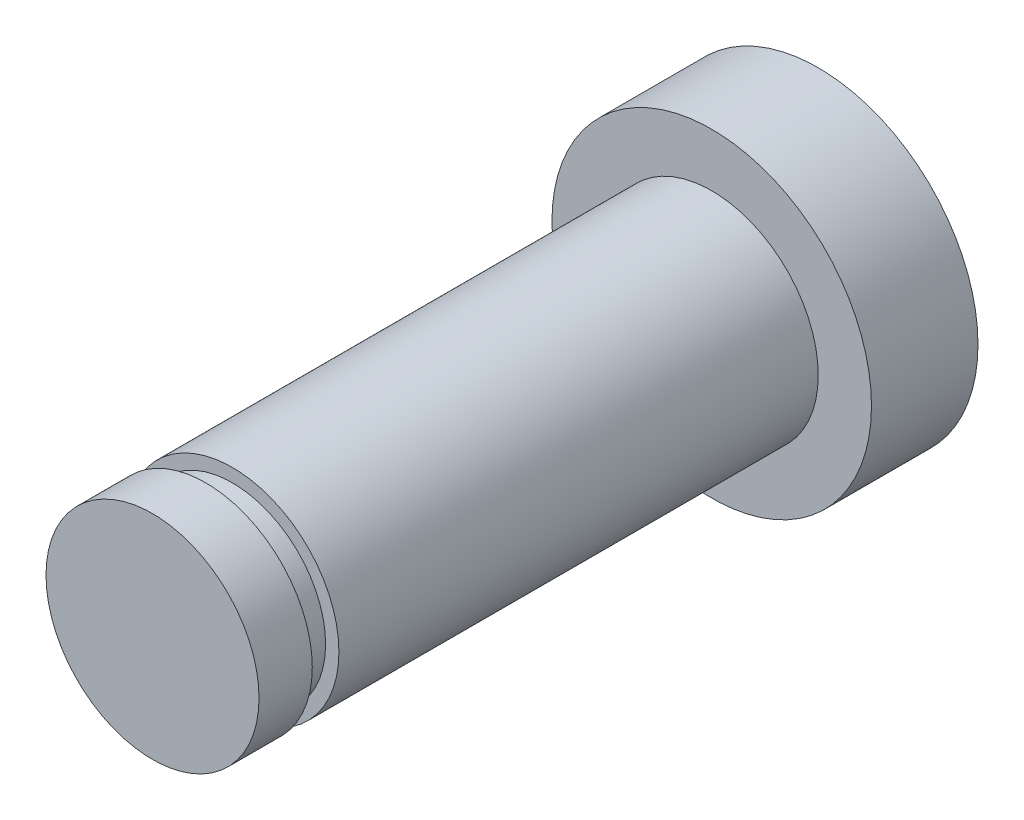
ISO-10303-21;
HEADER;
FILE_DESCRIPTION(('STEP AP214'),'2;1');
FILE_NAME('part.step','',(''),(''),'','','');
FILE_SCHEMA(('AUTOMOTIVE_DESIGN { 1 0 10303 214 1 1 1 1 }'));
ENDSEC;
DATA;
#1=APPLICATION_CONTEXT('core data for automotive mechanical design processes');
#2=APPLICATION_PROTOCOL_DEFINITION('international standard','automotive_design',2000,#1);
#3=PRODUCT_CONTEXT('',#1,'mechanical');
#4=PRODUCT('Part','Part','',(#3));
#5=PRODUCT_RELATED_PRODUCT_CATEGORY('part','',(#4));
#6=PRODUCT_DEFINITION_FORMATION('','',#4);
#7=PRODUCT_DEFINITION_CONTEXT('part definition',#1,'design');
#8=PRODUCT_DEFINITION('design','',#6,#7);
#9=PRODUCT_DEFINITION_SHAPE('','',#8);
#10=(LENGTH_UNIT() NAMED_UNIT(*) SI_UNIT(.MILLI.,.METRE.));
#11=(NAMED_UNIT(*) PLANE_ANGLE_UNIT() SI_UNIT($,.RADIAN.));
#12=(NAMED_UNIT(*) SI_UNIT($,.STERADIAN.) SOLID_ANGLE_UNIT());
#13=UNCERTAINTY_MEASURE_WITH_UNIT(LENGTH_MEASURE(1.E-05),#10,'distance_accuracy_value','');
#14=(GEOMETRIC_REPRESENTATION_CONTEXT(3) GLOBAL_UNCERTAINTY_ASSIGNED_CONTEXT((#13)) GLOBAL_UNIT_ASSIGNED_CONTEXT((#10,
#11,#12)) REPRESENTATION_CONTEXT('',''));
#15=CARTESIAN_POINT('',(0.,0.,0.));
#16=DIRECTION('',(0.,0.,1.));
#17=DIRECTION('',(1.,0.,0.));
#18=AXIS2_PLACEMENT_3D('',#15,#16,#17);
#19=CARTESIAN_POINT('',(0.,0.,4.));
#20=DIRECTION('',(0.,0.,-1.));
#21=DIRECTION('',(-1.,0.,0.));
#22=AXIS2_PLACEMENT_3D('',#19,#20,#21);
#23=CYLINDRICAL_SURFACE('',#22,6.);
#24=CARTESIAN_POINT('',(0.,0.,4.));
#25=DIRECTION('',(0.,0.,1.));
#26=DIRECTION('',(1.,0.,0.));
#27=AXIS2_PLACEMENT_3D('',#24,#25,#26);
#28=CIRCLE('',#27,6.);
#29=CARTESIAN_POINT('',(6.,0.,4.));
#30=VERTEX_POINT('',#29);
#31=EDGE_CURVE('E48',#30,#30,#28,.T.);
#32=ORIENTED_EDGE('',*,*,#31,.F.);
#33=EDGE_LOOP('',(#32));
#34=FACE_BOUND('',#33,.T.);
#35=CARTESIAN_POINT('',(0.,0.,0.));
#36=DIRECTION('',(0.,0.,1.));
#37=DIRECTION('',(1.,0.,0.));
#38=AXIS2_PLACEMENT_3D('',#35,#36,#37);
#39=CIRCLE('',#38,6.);
#40=CARTESIAN_POINT('',(6.,0.,0.));
#41=VERTEX_POINT('',#40);
#42=EDGE_CURVE('E39',#41,#41,#39,.T.);
#43=ORIENTED_EDGE('',*,*,#42,.T.);
#44=EDGE_LOOP('',(#43));
#45=FACE_BOUND('',#44,.T.);
#46=ADVANCED_FACE('F36',(#34,#45),#23,.T.);
#47=CARTESIAN_POINT('',(0.,0.,4.));
#48=DIRECTION('',(0.,0.,1.));
#49=DIRECTION('',(1.,0.,0.));
#50=AXIS2_PLACEMENT_3D('',#47,#48,#49);
#51=PLANE('',#50);
#52=CARTESIAN_POINT('',(0.,0.,4.));
#53=DIRECTION('',(0.,0.,1.));
#54=DIRECTION('',(1.,0.,0.));
#55=AXIS2_PLACEMENT_3D('',#52,#53,#54);
#56=CIRCLE('',#55,4.);
#57=CARTESIAN_POINT('',(4.,0.,4.));
#58=VERTEX_POINT('',#57);
#59=EDGE_CURVE('E43',#58,#58,#56,.T.);
#60=ORIENTED_EDGE('',*,*,#59,.F.);
#61=EDGE_LOOP('',(#60));
#62=FACE_BOUND('',#61,.T.);
#63=ORIENTED_EDGE('',*,*,#31,.T.);
#64=EDGE_LOOP('',(#63));
#65=FACE_BOUND('',#64,.T.);
#66=ADVANCED_FACE('F66',(#62,#65),#51,.T.);
#67=CARTESIAN_POINT('',(0.,0.,0.));
#68=DIRECTION('',(0.,0.,1.));
#69=DIRECTION('',(1.,0.,0.));
#70=AXIS2_PLACEMENT_3D('',#67,#68,#69);
#71=PLANE('',#70);
#72=ORIENTED_EDGE('',*,*,#42,.F.);
#73=EDGE_LOOP('',(#72));
#74=FACE_BOUND('',#73,.T.);
#75=ADVANCED_FACE('F63',(#74),#71,.F.);
#76=CARTESIAN_POINT('',(0.,0.,22.));
#77=DIRECTION('',(0.,0.,-1.));
#78=DIRECTION('',(-1.,0.,0.));
#79=AXIS2_PLACEMENT_3D('',#76,#77,#78);
#80=CYLINDRICAL_SURFACE('',#79,4.);
#81=CARTESIAN_POINT('',(0.,0.,22.));
#82=DIRECTION('',(0.,0.,1.));
#83=DIRECTION('',(1.,0.,0.));
#84=AXIS2_PLACEMENT_3D('',#81,#82,#83);
#85=CIRCLE('',#84,4.);
#86=CARTESIAN_POINT('',(4.,0.,22.));
#87=VERTEX_POINT('',#86);
#88=EDGE_CURVE('E54',#87,#87,#85,.T.);
#89=ORIENTED_EDGE('',*,*,#88,.F.);
#90=EDGE_LOOP('',(#89));
#91=FACE_BOUND('',#90,.T.);
#92=ORIENTED_EDGE('',*,*,#59,.T.);
#93=EDGE_LOOP('',(#92));
#94=FACE_BOUND('',#93,.T.);
#95=ADVANCED_FACE('F65',(#91,#94),#80,.T.);
#96=CARTESIAN_POINT('',(0.,0.,22.));
#97=DIRECTION('',(0.,0.,1.));
#98=DIRECTION('',(1.,0.,0.));
#99=AXIS2_PLACEMENT_3D('',#96,#97,#98);
#100=PLANE('',#99);
#101=CARTESIAN_POINT('',(0.,0.,22.));
#102=DIRECTION('',(0.,0.,1.));
#103=DIRECTION('',(1.,0.,0.));
#104=AXIS2_PLACEMENT_3D('',#101,#102,#103);
#105=CIRCLE('',#104,3.5);
#106=CARTESIAN_POINT('',(3.5,0.,22.));
#107=VERTEX_POINT('',#106);
#108=EDGE_CURVE('E10',#107,#107,#105,.T.);
#109=ORIENTED_EDGE('',*,*,#108,.F.);
#110=EDGE_LOOP('',(#109));
#111=FACE_BOUND('',#110,.T.);
#112=ORIENTED_EDGE('',*,*,#88,.T.);
#113=EDGE_LOOP('',(#112));
#114=FACE_BOUND('',#113,.T.);
#115=ADVANCED_FACE('F71',(#111,#114),#100,.T.);
#116=CARTESIAN_POINT('',(0.,0.,23.));
#117=DIRECTION('',(0.,0.,-1.));
#118=DIRECTION('',(-1.,0.,0.));
#119=AXIS2_PLACEMENT_3D('',#116,#117,#118);
#120=CYLINDRICAL_SURFACE('',#119,3.5);
#121=CARTESIAN_POINT('',(0.,0.,23.));
#122=DIRECTION('',(0.,0.,1.));
#123=DIRECTION('',(1.,0.,0.));
#124=AXIS2_PLACEMENT_3D('',#121,#122,#123);
#125=CIRCLE('',#124,3.5);
#126=CARTESIAN_POINT('',(3.5,0.,23.));
#127=VERTEX_POINT('',#126);
#128=EDGE_CURVE('E52',#127,#127,#125,.T.);
#129=ORIENTED_EDGE('',*,*,#128,.F.);
#130=EDGE_LOOP('',(#129));
#131=FACE_BOUND('',#130,.T.);
#132=ORIENTED_EDGE('',*,*,#108,.T.);
#133=EDGE_LOOP('',(#132));
#134=FACE_BOUND('',#133,.T.);
#135=ADVANCED_FACE('F101',(#131,#134),#120,.T.);
#136=CARTESIAN_POINT('',(0.,0.,25.));
#137=DIRECTION('',(0.,0.,-1.));
#138=DIRECTION('',(-1.,0.,0.));
#139=AXIS2_PLACEMENT_3D('',#136,#137,#138);
#140=CYLINDRICAL_SURFACE('',#139,4.);
#141=CARTESIAN_POINT('',(0.,0.,25.));
#142=DIRECTION('',(0.,0.,1.));
#143=DIRECTION('',(1.,0.,0.));
#144=AXIS2_PLACEMENT_3D('',#141,#142,#143);
#145=CIRCLE('',#144,4.);
#146=CARTESIAN_POINT('',(4.,0.,25.));
#147=VERTEX_POINT('',#146);
#148=EDGE_CURVE('E152',#147,#147,#145,.T.);
#149=ORIENTED_EDGE('',*,*,#148,.F.);
#150=EDGE_LOOP('',(#149));
#151=FACE_BOUND('',#150,.T.);
#152=CARTESIAN_POINT('',(0.,0.,23.));
#153=DIRECTION('',(0.,0.,1.));
#154=DIRECTION('',(1.,0.,0.));
#155=AXIS2_PLACEMENT_3D('',#152,#153,#154);
#156=CIRCLE('',#155,4.);
#157=CARTESIAN_POINT('',(4.,0.,23.));
#158=VERTEX_POINT('',#157);
#159=EDGE_CURVE('E150',#158,#158,#156,.T.);
#160=ORIENTED_EDGE('',*,*,#159,.T.);
#161=EDGE_LOOP('',(#160));
#162=FACE_BOUND('',#161,.T.);
#163=ADVANCED_FACE('F111',(#151,#162),#140,.T.);
#164=CARTESIAN_POINT('',(0.,0.,25.));
#165=DIRECTION('',(0.,0.,1.));
#166=DIRECTION('',(1.,0.,0.));
#167=AXIS2_PLACEMENT_3D('',#164,#165,#166);
#168=PLANE('',#167);
#169=ORIENTED_EDGE('',*,*,#148,.T.);
#170=EDGE_LOOP('',(#169));
#171=FACE_BOUND('',#170,.T.);
#172=ADVANCED_FACE('F121',(#171),#168,.T.);
#173=CARTESIAN_POINT('',(0.,0.,23.));
#174=DIRECTION('',(0.,0.,1.));
#175=DIRECTION('',(1.,0.,0.));
#176=AXIS2_PLACEMENT_3D('',#173,#174,#175);
#177=PLANE('',#176);
#178=ORIENTED_EDGE('',*,*,#128,.T.);
#179=EDGE_LOOP('',(#178));
#180=FACE_BOUND('',#179,.T.);
#181=ORIENTED_EDGE('',*,*,#159,.F.);
#182=EDGE_LOOP('',(#181));
#183=FACE_BOUND('',#182,.T.);
#184=ADVANCED_FACE('F131',(#180,#183),#177,.F.);
#185=CLOSED_SHELL('',(#46,#66,#75,#95,#115,#135,#163,#172,#184));
#186=MANIFOLD_SOLID_BREP('B2',#185);
#187=ADVANCED_BREP_SHAPE_REPRESENTATION('',(#18,#186),#14);
#188=SHAPE_DEFINITION_REPRESENTATION(#9,#187);
ENDSEC;
END-ISO-10303-21;
